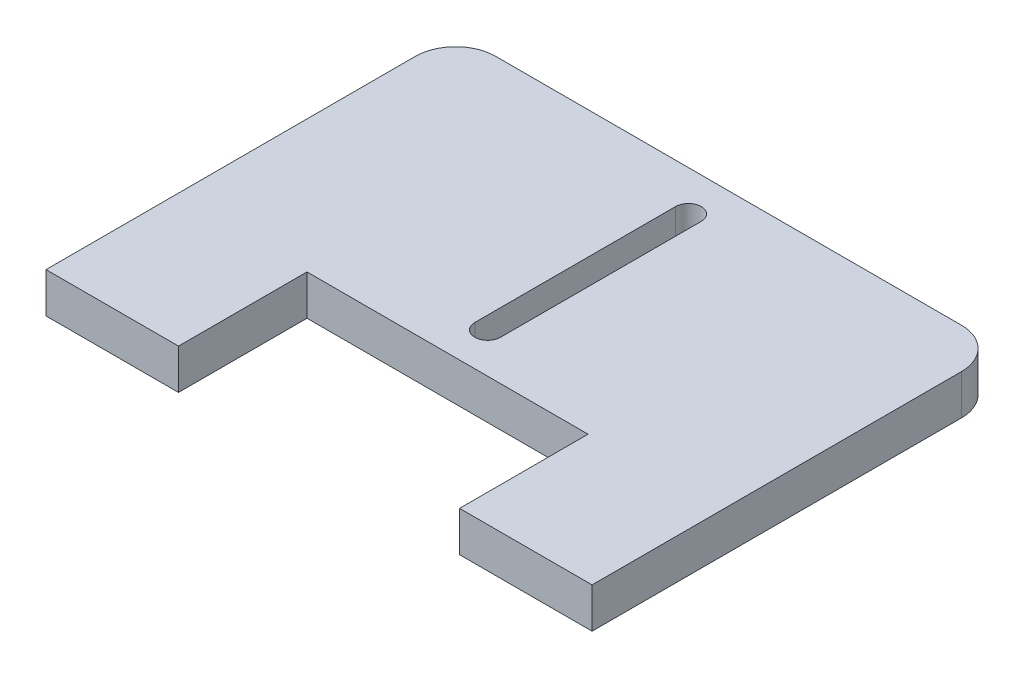
ISO-10303-21;
HEADER;
FILE_DESCRIPTION(('STEP AP214'),'2;1');
FILE_NAME('part.step','',(''),(''),'','','');
FILE_SCHEMA(('AUTOMOTIVE_DESIGN { 1 0 10303 214 1 1 1 1 }'));
ENDSEC;
DATA;
#1=APPLICATION_CONTEXT('core data for automotive mechanical design processes');
#2=APPLICATION_PROTOCOL_DEFINITION('international standard','automotive_design',2000,#1);
#3=PRODUCT_CONTEXT('',#1,'mechanical');
#4=PRODUCT('Part','Part','',(#3));
#5=PRODUCT_RELATED_PRODUCT_CATEGORY('part','',(#4));
#6=PRODUCT_DEFINITION_FORMATION('','',#4);
#7=PRODUCT_DEFINITION_CONTEXT('part definition',#1,'design');
#8=PRODUCT_DEFINITION('design','',#6,#7);
#9=PRODUCT_DEFINITION_SHAPE('','',#8);
#10=(LENGTH_UNIT() NAMED_UNIT(*) SI_UNIT(.MILLI.,.METRE.));
#11=(NAMED_UNIT(*) PLANE_ANGLE_UNIT() SI_UNIT($,.RADIAN.));
#12=(NAMED_UNIT(*) SI_UNIT($,.STERADIAN.) SOLID_ANGLE_UNIT());
#13=UNCERTAINTY_MEASURE_WITH_UNIT(LENGTH_MEASURE(1.E-05),#10,'distance_accuracy_value','');
#14=(GEOMETRIC_REPRESENTATION_CONTEXT(3) GLOBAL_UNCERTAINTY_ASSIGNED_CONTEXT((#13)) GLOBAL_UNIT_ASSIGNED_CONTEXT((#10,
#11,#12)) REPRESENTATION_CONTEXT('',''));
#15=CARTESIAN_POINT('',(0.,0.,0.));
#16=DIRECTION('',(0.,0.,1.));
#17=DIRECTION('',(1.,0.,0.));
#18=AXIS2_PLACEMENT_3D('',#15,#16,#17);
#19=CARTESIAN_POINT('',(0.,5.,0.));
#20=DIRECTION('',(0.,-1.,0.));
#21=DIRECTION('',(0.,0.,-1.));
#22=AXIS2_PLACEMENT_3D('',#19,#20,#21);
#23=PLANE('',#22);
#24=DIRECTION('',(0.,0.,-1.));
#25=VECTOR('',#24,1.);
#26=CARTESIAN_POINT('',(34.,5.,5.15094416024362));
#27=LINE('',#26,#25);
#28=CARTESIAN_POINT('',(34.,5.,28.1509441602436));
#29=VERTEX_POINT('',#28);
#30=CARTESIAN_POINT('',(34.,5.,-17.8490558397564));
#31=VERTEX_POINT('',#30);
#32=EDGE_CURVE('E223',#29,#31,#27,.T.);
#33=ORIENTED_EDGE('',*,*,#32,.T.);
#34=CARTESIAN_POINT('',(29.,5.,-17.8490558397564));
#35=DIRECTION('',(0.,-1.,0.));
#36=DIRECTION('',(0.,0.,-1.));
#37=AXIS2_PLACEMENT_3D('',#34,#35,#36);
#38=CIRCLE('',#37,5.);
#39=CARTESIAN_POINT('',(29.,5.,-22.8490558397564));
#40=VERTEX_POINT('',#39);
#41=EDGE_CURVE('E54',#31,#40,#38,.F.);
#42=ORIENTED_EDGE('',*,*,#41,.T.);
#43=DIRECTION('',(-1.,0.,0.));
#44=VECTOR('',#43,1.);
#45=CARTESIAN_POINT('',(30.,5.,-22.8490558397564));
#46=LINE('',#45,#44);
#47=CARTESIAN_POINT('',(-29.,5.,-22.8490558397564));
#48=VERTEX_POINT('',#47);
#49=EDGE_CURVE('E226',#40,#48,#46,.T.);
#50=ORIENTED_EDGE('',*,*,#49,.T.);
#51=CARTESIAN_POINT('',(-29.,5.,-17.8490558397564));
#52=DIRECTION('',(0.,-1.,0.));
#53=DIRECTION('',(0.,0.,-1.));
#54=AXIS2_PLACEMENT_3D('',#51,#52,#53);
#55=CIRCLE('',#54,5.);
#56=CARTESIAN_POINT('',(-34.,5.,-17.8490558397564));
#57=VERTEX_POINT('',#56);
#58=EDGE_CURVE('E61',#48,#57,#55,.F.);
#59=ORIENTED_EDGE('',*,*,#58,.T.);
#60=DIRECTION('',(0.,0.,1.));
#61=VECTOR('',#60,1.);
#62=CARTESIAN_POINT('',(-34.,5.,5.15094416024363));
#63=LINE('',#62,#61);
#64=CARTESIAN_POINT('',(-34.,5.,28.1509441602436));
#65=VERTEX_POINT('',#64);
#66=EDGE_CURVE('E204',#57,#65,#63,.T.);
#67=ORIENTED_EDGE('',*,*,#66,.T.);
#68=DIRECTION('',(1.,0.,0.));
#69=VECTOR('',#68,1.);
#70=CARTESIAN_POINT('',(-34.,5.,28.1509441602436));
#71=LINE('',#70,#69);
#72=CARTESIAN_POINT('',(-17.5,5.,28.1509441602436));
#73=VERTEX_POINT('',#72);
#74=EDGE_CURVE('E207',#65,#73,#71,.T.);
#75=ORIENTED_EDGE('',*,*,#74,.T.);
#76=DIRECTION('',(0.,0.,-1.));
#77=VECTOR('',#76,1.);
#78=CARTESIAN_POINT('',(-17.5,5.,28.1509441602436));
#79=LINE('',#78,#77);
#80=CARTESIAN_POINT('',(-17.5,5.,12.1509441602436));
#81=VERTEX_POINT('',#80);
#82=EDGE_CURVE('E211',#73,#81,#79,.T.);
#83=ORIENTED_EDGE('',*,*,#82,.T.);
#84=DIRECTION('',(1.,0.,0.));
#85=VECTOR('',#84,1.);
#86=CARTESIAN_POINT('',(-17.5,5.,12.1509441602436));
#87=LINE('',#86,#85);
#88=CARTESIAN_POINT('',(17.5,5.,12.1509441602436));
#89=VERTEX_POINT('',#88);
#90=EDGE_CURVE('E214',#81,#89,#87,.T.);
#91=ORIENTED_EDGE('',*,*,#90,.T.);
#92=DIRECTION('',(0.,0.,1.));
#93=VECTOR('',#92,1.);
#94=CARTESIAN_POINT('',(17.5,5.,28.1509441602436));
#95=LINE('',#94,#93);
#96=CARTESIAN_POINT('',(17.5,5.,28.1509441602436));
#97=VERTEX_POINT('',#96);
#98=EDGE_CURVE('E217',#89,#97,#95,.T.);
#99=ORIENTED_EDGE('',*,*,#98,.T.);
#100=DIRECTION('',(1.,0.,0.));
#101=VECTOR('',#100,1.);
#102=CARTESIAN_POINT('',(34.,5.,28.1509441602436));
#103=LINE('',#102,#101);
#104=EDGE_CURVE('E220',#97,#29,#103,.T.);
#105=ORIENTED_EDGE('',*,*,#104,.T.);
#106=EDGE_LOOP('',(#33,#42,#50,#59,#67,#75,#83,#91,#99,#105));
#107=FACE_BOUND('',#106,.T.);
#108=CARTESIAN_POINT('',(0.,5.,-17.8490558397564));
#109=DIRECTION('',(0.,1.,0.));
#110=DIRECTION('',(0.,0.,1.));
#111=AXIS2_PLACEMENT_3D('',#108,#109,#110);
#112=CIRCLE('',#111,1.6);
#113=CARTESIAN_POINT('',(1.6,5.,-17.8490558397564));
#114=VERTEX_POINT('',#113);
#115=CARTESIAN_POINT('',(-1.6,5.,-17.8490558397564));
#116=VERTEX_POINT('',#115);
#117=EDGE_CURVE('E151',#114,#116,#112,.T.);
#118=ORIENTED_EDGE('',*,*,#117,.F.);
#119=DIRECTION('',(0.,0.,-1.));
#120=VECTOR('',#119,1.);
#121=CARTESIAN_POINT('',(1.6,5.,-17.8490558397564));
#122=LINE('',#121,#120);
#123=CARTESIAN_POINT('',(1.6,5.,7.15094416024363));
#124=VERTEX_POINT('',#123);
#125=EDGE_CURVE('E180',#124,#114,#122,.T.);
#126=ORIENTED_EDGE('',*,*,#125,.F.);
#127=CARTESIAN_POINT('',(0.,5.,7.15094416024363));
#128=DIRECTION('',(0.,1.,0.));
#129=DIRECTION('',(0.,0.,1.));
#130=AXIS2_PLACEMENT_3D('',#127,#128,#129);
#131=CIRCLE('',#130,1.6);
#132=CARTESIAN_POINT('',(-1.6,5.,7.15094416024363));
#133=VERTEX_POINT('',#132);
#134=EDGE_CURVE('E176',#133,#124,#131,.T.);
#135=ORIENTED_EDGE('',*,*,#134,.F.);
#136=DIRECTION('',(0.,0.,1.));
#137=VECTOR('',#136,1.);
#138=CARTESIAN_POINT('',(-1.6,5.,-17.8490558397564));
#139=LINE('',#138,#137);
#140=EDGE_CURVE('E162',#116,#133,#139,.T.);
#141=ORIENTED_EDGE('',*,*,#140,.F.);
#142=EDGE_LOOP('',(#118,#126,#135,#141));
#143=FACE_BOUND('',#142,.T.);
#144=ADVANCED_FACE('F45',(#107,#143),#23,.F.);
#145=CARTESIAN_POINT('',(0.,0.,0.));
#146=DIRECTION('',(0.,-1.,0.));
#147=DIRECTION('',(0.,0.,-1.));
#148=AXIS2_PLACEMENT_3D('',#145,#146,#147);
#149=PLANE('',#148);
#150=DIRECTION('',(-1.,0.,0.));
#151=VECTOR('',#150,1.);
#152=CARTESIAN_POINT('',(30.,0.,-22.8490558397564));
#153=LINE('',#152,#151);
#154=CARTESIAN_POINT('',(29.,0.,-22.8490558397564));
#155=VERTEX_POINT('',#154);
#156=CARTESIAN_POINT('',(-29.,0.,-22.8490558397564));
#157=VERTEX_POINT('',#156);
#158=EDGE_CURVE('E208',#155,#157,#153,.T.);
#159=ORIENTED_EDGE('',*,*,#158,.F.);
#160=CARTESIAN_POINT('',(29.,0.,-17.8490558397564));
#161=DIRECTION('',(0.,-1.,0.));
#162=DIRECTION('',(0.,0.,-1.));
#163=AXIS2_PLACEMENT_3D('',#160,#161,#162);
#164=CIRCLE('',#163,5.);
#165=CARTESIAN_POINT('',(34.,0.,-17.8490558397564));
#166=VERTEX_POINT('',#165);
#167=EDGE_CURVE('E286',#155,#166,#164,.T.);
#168=ORIENTED_EDGE('',*,*,#167,.T.);
#169=DIRECTION('',(0.,0.,-1.));
#170=VECTOR('',#169,1.);
#171=CARTESIAN_POINT('',(34.,0.,5.15094416024362));
#172=LINE('',#171,#170);
#173=CARTESIAN_POINT('',(34.,0.,28.1509441602436));
#174=VERTEX_POINT('',#173);
#175=EDGE_CURVE('E247',#174,#166,#172,.T.);
#176=ORIENTED_EDGE('',*,*,#175,.F.);
#177=DIRECTION('',(1.,0.,0.));
#178=VECTOR('',#177,1.);
#179=CARTESIAN_POINT('',(34.,0.,28.1509441602436));
#180=LINE('',#179,#178);
#181=CARTESIAN_POINT('',(17.5,0.,28.1509441602436));
#182=VERTEX_POINT('',#181);
#183=EDGE_CURVE('E244',#182,#174,#180,.T.);
#184=ORIENTED_EDGE('',*,*,#183,.F.);
#185=DIRECTION('',(0.,0.,1.));
#186=VECTOR('',#185,1.);
#187=CARTESIAN_POINT('',(17.5,0.,28.1509441602436));
#188=LINE('',#187,#186);
#189=CARTESIAN_POINT('',(17.5,0.,12.1509441602436));
#190=VERTEX_POINT('',#189);
#191=EDGE_CURVE('E241',#190,#182,#188,.T.);
#192=ORIENTED_EDGE('',*,*,#191,.F.);
#193=DIRECTION('',(1.,0.,0.));
#194=VECTOR('',#193,1.);
#195=CARTESIAN_POINT('',(-17.5,0.,12.1509441602436));
#196=LINE('',#195,#194);
#197=CARTESIAN_POINT('',(-17.5,0.,12.1509441602436));
#198=VERTEX_POINT('',#197);
#199=EDGE_CURVE('E238',#198,#190,#196,.T.);
#200=ORIENTED_EDGE('',*,*,#199,.F.);
#201=DIRECTION('',(0.,0.,-1.));
#202=VECTOR('',#201,1.);
#203=CARTESIAN_POINT('',(-17.5,0.,28.1509441602436));
#204=LINE('',#203,#202);
#205=CARTESIAN_POINT('',(-17.5,0.,28.1509441602436));
#206=VERTEX_POINT('',#205);
#207=EDGE_CURVE('E235',#206,#198,#204,.T.);
#208=ORIENTED_EDGE('',*,*,#207,.F.);
#209=DIRECTION('',(1.,0.,0.));
#210=VECTOR('',#209,1.);
#211=CARTESIAN_POINT('',(-34.,0.,28.1509441602436));
#212=LINE('',#211,#210);
#213=CARTESIAN_POINT('',(-34.,0.,28.1509441602436));
#214=VERTEX_POINT('',#213);
#215=EDGE_CURVE('E232',#214,#206,#212,.T.);
#216=ORIENTED_EDGE('',*,*,#215,.F.);
#217=DIRECTION('',(0.,0.,1.));
#218=VECTOR('',#217,1.);
#219=CARTESIAN_POINT('',(-34.,0.,5.15094416024363));
#220=LINE('',#219,#218);
#221=CARTESIAN_POINT('',(-34.,0.,-17.8490558397564));
#222=VERTEX_POINT('',#221);
#223=EDGE_CURVE('E171',#222,#214,#220,.T.);
#224=ORIENTED_EDGE('',*,*,#223,.F.);
#225=CARTESIAN_POINT('',(-29.,0.,-17.8490558397564));
#226=DIRECTION('',(0.,-1.,0.));
#227=DIRECTION('',(0.,0.,-1.));
#228=AXIS2_PLACEMENT_3D('',#225,#226,#227);
#229=CIRCLE('',#228,5.);
#230=EDGE_CURVE('E283',#222,#157,#229,.T.);
#231=ORIENTED_EDGE('',*,*,#230,.T.);
#232=EDGE_LOOP('',(#159,#168,#176,#184,#192,#200,#208,#216,#224,#231));
#233=FACE_BOUND('',#232,.T.);
#234=DIRECTION('',(0.,0.,-1.));
#235=VECTOR('',#234,1.);
#236=CARTESIAN_POINT('',(1.6,0.,-17.8490558397564));
#237=LINE('',#236,#235);
#238=CARTESIAN_POINT('',(1.6,0.,7.15094416024363));
#239=VERTEX_POINT('',#238);
#240=CARTESIAN_POINT('',(1.6,0.,-17.8490558397564));
#241=VERTEX_POINT('',#240);
#242=EDGE_CURVE('E163',#239,#241,#237,.T.);
#243=ORIENTED_EDGE('',*,*,#242,.T.);
#244=CARTESIAN_POINT('',(0.,0.,-17.8490558397564));
#245=DIRECTION('',(0.,1.,0.));
#246=DIRECTION('',(0.,0.,1.));
#247=AXIS2_PLACEMENT_3D('',#244,#245,#246);
#248=CIRCLE('',#247,1.6);
#249=CARTESIAN_POINT('',(-1.6,0.,-17.8490558397564));
#250=VERTEX_POINT('',#249);
#251=EDGE_CURVE('E185',#241,#250,#248,.T.);
#252=ORIENTED_EDGE('',*,*,#251,.T.);
#253=DIRECTION('',(0.,0.,1.));
#254=VECTOR('',#253,1.);
#255=CARTESIAN_POINT('',(-1.6,0.,-17.8490558397564));
#256=LINE('',#255,#254);
#257=CARTESIAN_POINT('',(-1.6,0.,7.15094416024363));
#258=VERTEX_POINT('',#257);
#259=EDGE_CURVE('E169',#250,#258,#256,.T.);
#260=ORIENTED_EDGE('',*,*,#259,.T.);
#261=CARTESIAN_POINT('',(0.,0.,7.15094416024363));
#262=DIRECTION('',(0.,1.,0.));
#263=DIRECTION('',(0.,0.,1.));
#264=AXIS2_PLACEMENT_3D('',#261,#262,#263);
#265=CIRCLE('',#264,1.6);
#266=EDGE_CURVE('E190',#258,#239,#265,.T.);
#267=ORIENTED_EDGE('',*,*,#266,.T.);
#268=EDGE_LOOP('',(#243,#252,#260,#267));
#269=FACE_BOUND('',#268,.T.);
#270=ADVANCED_FACE('F304',(#233,#269),#149,.T.);
#271=CARTESIAN_POINT('',(-34.,5.,5.15094416024363));
#272=DIRECTION('',(1.,0.,0.));
#273=DIRECTION('',(0.,0.,-1.));
#274=AXIS2_PLACEMENT_3D('',#271,#272,#273);
#275=PLANE('',#274);
#276=ORIENTED_EDGE('',*,*,#66,.F.);
#277=DIRECTION('',(0.,-1.,0.));
#278=VECTOR('',#277,1.);
#279=CARTESIAN_POINT('',(-34.,5.,-17.8490558397564));
#280=LINE('',#279,#278);
#281=EDGE_CURVE('E11',#57,#222,#280,.T.);
#282=ORIENTED_EDGE('',*,*,#281,.T.);
#283=ORIENTED_EDGE('',*,*,#223,.T.);
#284=DIRECTION('',(0.,-1.,0.));
#285=VECTOR('',#284,1.);
#286=CARTESIAN_POINT('',(-34.,5.,28.1509441602436));
#287=LINE('',#286,#285);
#288=EDGE_CURVE('E272',#65,#214,#287,.T.);
#289=ORIENTED_EDGE('',*,*,#288,.F.);
#290=EDGE_LOOP('',(#276,#282,#283,#289));
#291=FACE_BOUND('',#290,.T.);
#292=ADVANCED_FACE('F335',(#291),#275,.F.);
#293=CARTESIAN_POINT('',(-34.,5.,28.1509441602436));
#294=DIRECTION('',(0.,0.,-1.));
#295=DIRECTION('',(-1.,0.,0.));
#296=AXIS2_PLACEMENT_3D('',#293,#294,#295);
#297=PLANE('',#296);
#298=ORIENTED_EDGE('',*,*,#215,.T.);
#299=DIRECTION('',(0.,-1.,0.));
#300=VECTOR('',#299,1.);
#301=CARTESIAN_POINT('',(-17.5,5.,28.1509441602436));
#302=LINE('',#301,#300);
#303=EDGE_CURVE('E268',#73,#206,#302,.T.);
#304=ORIENTED_EDGE('',*,*,#303,.F.);
#305=ORIENTED_EDGE('',*,*,#74,.F.);
#306=ORIENTED_EDGE('',*,*,#288,.T.);
#307=EDGE_LOOP('',(#298,#304,#305,#306));
#308=FACE_BOUND('',#307,.T.);
#309=ADVANCED_FACE('F331',(#308),#297,.F.);
#310=CARTESIAN_POINT('',(-17.5,5.,28.1509441602436));
#311=DIRECTION('',(-1.,0.,0.));
#312=DIRECTION('',(0.,0.,1.));
#313=AXIS2_PLACEMENT_3D('',#310,#311,#312);
#314=PLANE('',#313);
#315=ORIENTED_EDGE('',*,*,#207,.T.);
#316=DIRECTION('',(0.,-1.,0.));
#317=VECTOR('',#316,1.);
#318=CARTESIAN_POINT('',(-17.5,5.,12.1509441602436));
#319=LINE('',#318,#317);
#320=EDGE_CURVE('E264',#81,#198,#319,.T.);
#321=ORIENTED_EDGE('',*,*,#320,.F.);
#322=ORIENTED_EDGE('',*,*,#82,.F.);
#323=ORIENTED_EDGE('',*,*,#303,.T.);
#324=EDGE_LOOP('',(#315,#321,#322,#323));
#325=FACE_BOUND('',#324,.T.);
#326=ADVANCED_FACE('F326',(#325),#314,.F.);
#327=CARTESIAN_POINT('',(-17.5,5.,12.1509441602436));
#328=DIRECTION('',(0.,0.,-1.));
#329=DIRECTION('',(-1.,0.,0.));
#330=AXIS2_PLACEMENT_3D('',#327,#328,#329);
#331=PLANE('',#330);
#332=ORIENTED_EDGE('',*,*,#199,.T.);
#333=DIRECTION('',(0.,-1.,0.));
#334=VECTOR('',#333,1.);
#335=CARTESIAN_POINT('',(17.5,5.,12.1509441602436));
#336=LINE('',#335,#334);
#337=EDGE_CURVE('E260',#89,#190,#336,.T.);
#338=ORIENTED_EDGE('',*,*,#337,.F.);
#339=ORIENTED_EDGE('',*,*,#90,.F.);
#340=ORIENTED_EDGE('',*,*,#320,.T.);
#341=EDGE_LOOP('',(#332,#338,#339,#340));
#342=FACE_BOUND('',#341,.T.);
#343=ADVANCED_FACE('F322',(#342),#331,.F.);
#344=CARTESIAN_POINT('',(17.5,5.,28.1509441602436));
#345=DIRECTION('',(1.,0.,0.));
#346=DIRECTION('',(0.,0.,-1.));
#347=AXIS2_PLACEMENT_3D('',#344,#345,#346);
#348=PLANE('',#347);
#349=ORIENTED_EDGE('',*,*,#191,.T.);
#350=DIRECTION('',(0.,-1.,0.));
#351=VECTOR('',#350,1.);
#352=CARTESIAN_POINT('',(17.5,5.,28.1509441602436));
#353=LINE('',#352,#351);
#354=EDGE_CURVE('E256',#97,#182,#353,.T.);
#355=ORIENTED_EDGE('',*,*,#354,.F.);
#356=ORIENTED_EDGE('',*,*,#98,.F.);
#357=ORIENTED_EDGE('',*,*,#337,.T.);
#358=EDGE_LOOP('',(#349,#355,#356,#357));
#359=FACE_BOUND('',#358,.T.);
#360=ADVANCED_FACE('F317',(#359),#348,.F.);
#361=CARTESIAN_POINT('',(34.,5.,28.1509441602436));
#362=DIRECTION('',(0.,0.,-1.));
#363=DIRECTION('',(-1.,0.,0.));
#364=AXIS2_PLACEMENT_3D('',#361,#362,#363);
#365=PLANE('',#364);
#366=ORIENTED_EDGE('',*,*,#183,.T.);
#367=DIRECTION('',(0.,-1.,0.));
#368=VECTOR('',#367,1.);
#369=CARTESIAN_POINT('',(34.,5.,28.1509441602436));
#370=LINE('',#369,#368);
#371=EDGE_CURVE('E229',#29,#174,#370,.T.);
#372=ORIENTED_EDGE('',*,*,#371,.F.);
#373=ORIENTED_EDGE('',*,*,#104,.F.);
#374=ORIENTED_EDGE('',*,*,#354,.T.);
#375=EDGE_LOOP('',(#366,#372,#373,#374));
#376=FACE_BOUND('',#375,.T.);
#377=ADVANCED_FACE('F311',(#376),#365,.F.);
#378=CARTESIAN_POINT('',(34.,5.,5.15094416024362));
#379=DIRECTION('',(-1.,0.,0.));
#380=DIRECTION('',(0.,0.,1.));
#381=AXIS2_PLACEMENT_3D('',#378,#379,#380);
#382=PLANE('',#381);
#383=ORIENTED_EDGE('',*,*,#175,.T.);
#384=DIRECTION('',(0.,-1.,0.));
#385=VECTOR('',#384,1.);
#386=CARTESIAN_POINT('',(34.,5.,-17.8490558397564));
#387=LINE('',#386,#385);
#388=EDGE_CURVE('E69',#166,#31,#387,.F.);
#389=ORIENTED_EDGE('',*,*,#388,.T.);
#390=ORIENTED_EDGE('',*,*,#32,.F.);
#391=ORIENTED_EDGE('',*,*,#371,.T.);
#392=EDGE_LOOP('',(#383,#389,#390,#391));
#393=FACE_BOUND('',#392,.T.);
#394=ADVANCED_FACE('F307',(#393),#382,.F.);
#395=CARTESIAN_POINT('',(30.,5.,-22.8490558397564));
#396=DIRECTION('',(0.,0.,1.));
#397=DIRECTION('',(1.,0.,0.));
#398=AXIS2_PLACEMENT_3D('',#395,#396,#397);
#399=PLANE('',#398);
#400=ORIENTED_EDGE('',*,*,#49,.F.);
#401=DIRECTION('',(0.,-1.,0.));
#402=VECTOR('',#401,1.);
#403=CARTESIAN_POINT('',(29.,5.,-22.8490558397564));
#404=LINE('',#403,#402);
#405=EDGE_CURVE('E279',#40,#155,#404,.T.);
#406=ORIENTED_EDGE('',*,*,#405,.T.);
#407=ORIENTED_EDGE('',*,*,#158,.T.);
#408=DIRECTION('',(0.,-1.,0.));
#409=VECTOR('',#408,1.);
#410=CARTESIAN_POINT('',(-29.,5.,-22.8490558397564));
#411=LINE('',#410,#409);
#412=EDGE_CURVE('E276',#157,#48,#411,.F.);
#413=ORIENTED_EDGE('',*,*,#412,.T.);
#414=EDGE_LOOP('',(#400,#406,#407,#413));
#415=FACE_BOUND('',#414,.T.);
#416=ADVANCED_FACE('F298',(#415),#399,.F.);
#417=CARTESIAN_POINT('',(0.,5.,-17.8490558397564));
#418=DIRECTION('',(0.,-1.,0.));
#419=DIRECTION('',(0.,0.,-1.));
#420=AXIS2_PLACEMENT_3D('',#417,#418,#419);
#421=CYLINDRICAL_SURFACE('',#420,1.6);
#422=ORIENTED_EDGE('',*,*,#251,.F.);
#423=DIRECTION('',(0.,-1.,0.));
#424=VECTOR('',#423,1.);
#425=CARTESIAN_POINT('',(1.6,5.,-17.8490558397564));
#426=LINE('',#425,#424);
#427=EDGE_CURVE('E157',#114,#241,#426,.T.);
#428=ORIENTED_EDGE('',*,*,#427,.F.);
#429=ORIENTED_EDGE('',*,*,#117,.T.);
#430=DIRECTION('',(0.,-1.,0.));
#431=VECTOR('',#430,1.);
#432=CARTESIAN_POINT('',(-1.6,5.,-17.8490558397564));
#433=LINE('',#432,#431);
#434=EDGE_CURVE('E154',#116,#250,#433,.T.);
#435=ORIENTED_EDGE('',*,*,#434,.T.);
#436=EDGE_LOOP('',(#422,#428,#429,#435));
#437=FACE_BOUND('',#436,.T.);
#438=ADVANCED_FACE('F153',(#437),#421,.F.);
#439=CARTESIAN_POINT('',(-1.6,5.,-17.8490558397564));
#440=DIRECTION('',(1.,0.,0.));
#441=DIRECTION('',(0.,0.,-1.));
#442=AXIS2_PLACEMENT_3D('',#439,#440,#441);
#443=PLANE('',#442);
#444=ORIENTED_EDGE('',*,*,#259,.F.);
#445=ORIENTED_EDGE('',*,*,#434,.F.);
#446=ORIENTED_EDGE('',*,*,#140,.T.);
#447=DIRECTION('',(0.,-1.,0.));
#448=VECTOR('',#447,1.);
#449=CARTESIAN_POINT('',(-1.6,5.,7.15094416024363));
#450=LINE('',#449,#448);
#451=EDGE_CURVE('E172',#133,#258,#450,.T.);
#452=ORIENTED_EDGE('',*,*,#451,.T.);
#453=EDGE_LOOP('',(#444,#445,#446,#452));
#454=FACE_BOUND('',#453,.T.);
#455=ADVANCED_FACE('F166',(#454),#443,.T.);
#456=CARTESIAN_POINT('',(0.,5.,7.15094416024363));
#457=DIRECTION('',(0.,-1.,0.));
#458=DIRECTION('',(0.,0.,-1.));
#459=AXIS2_PLACEMENT_3D('',#456,#457,#458);
#460=CYLINDRICAL_SURFACE('',#459,1.6);
#461=ORIENTED_EDGE('',*,*,#266,.F.);
#462=ORIENTED_EDGE('',*,*,#451,.F.);
#463=ORIENTED_EDGE('',*,*,#134,.T.);
#464=DIRECTION('',(0.,-1.,0.));
#465=VECTOR('',#464,1.);
#466=CARTESIAN_POINT('',(1.6,5.,7.15094416024363));
#467=LINE('',#466,#465);
#468=EDGE_CURVE('E199',#124,#239,#467,.T.);
#469=ORIENTED_EDGE('',*,*,#468,.T.);
#470=EDGE_LOOP('',(#461,#462,#463,#469));
#471=FACE_BOUND('',#470,.T.);
#472=ADVANCED_FACE('F399',(#471),#460,.F.);
#473=CARTESIAN_POINT('',(1.6,5.,-17.8490558397564));
#474=DIRECTION('',(-1.,0.,0.));
#475=DIRECTION('',(0.,0.,1.));
#476=AXIS2_PLACEMENT_3D('',#473,#474,#475);
#477=PLANE('',#476);
#478=ORIENTED_EDGE('',*,*,#242,.F.);
#479=ORIENTED_EDGE('',*,*,#468,.F.);
#480=ORIENTED_EDGE('',*,*,#125,.T.);
#481=ORIENTED_EDGE('',*,*,#427,.T.);
#482=EDGE_LOOP('',(#478,#479,#480,#481));
#483=FACE_BOUND('',#482,.T.);
#484=ADVANCED_FACE('F342',(#483),#477,.T.);
#485=CARTESIAN_POINT('',(29.,5.,-17.8490558397564));
#486=DIRECTION('',(0.,-1.,0.));
#487=DIRECTION('',(0.,0.,-1.));
#488=AXIS2_PLACEMENT_3D('',#485,#486,#487);
#489=CYLINDRICAL_SURFACE('',#488,5.);
#490=ORIENTED_EDGE('',*,*,#41,.F.);
#491=ORIENTED_EDGE('',*,*,#388,.F.);
#492=ORIENTED_EDGE('',*,*,#167,.F.);
#493=ORIENTED_EDGE('',*,*,#405,.F.);
#494=EDGE_LOOP('',(#490,#491,#492,#493));
#495=FACE_BOUND('',#494,.T.);
#496=ADVANCED_FACE('F301',(#495),#489,.T.);
#497=CARTESIAN_POINT('',(-29.,5.,-17.8490558397564));
#498=DIRECTION('',(0.,-1.,0.));
#499=DIRECTION('',(0.,0.,-1.));
#500=AXIS2_PLACEMENT_3D('',#497,#498,#499);
#501=CYLINDRICAL_SURFACE('',#500,5.);
#502=ORIENTED_EDGE('',*,*,#58,.F.);
#503=ORIENTED_EDGE('',*,*,#412,.F.);
#504=ORIENTED_EDGE('',*,*,#230,.F.);
#505=ORIENTED_EDGE('',*,*,#281,.F.);
#506=EDGE_LOOP('',(#502,#503,#504,#505));
#507=FACE_BOUND('',#506,.T.);
#508=ADVANCED_FACE('F47',(#507),#501,.T.);
#509=CLOSED_SHELL('',(#144,#270,#292,#309,#326,#343,#360,#377,#394,#416,#438,#455,#472,#484,
#496,#508));
#510=MANIFOLD_SOLID_BREP('B2',#509);
#511=ADVANCED_BREP_SHAPE_REPRESENTATION('',(#18,#510),#14);
#512=SHAPE_DEFINITION_REPRESENTATION(#9,#511);
ENDSEC;
END-ISO-10303-21;
